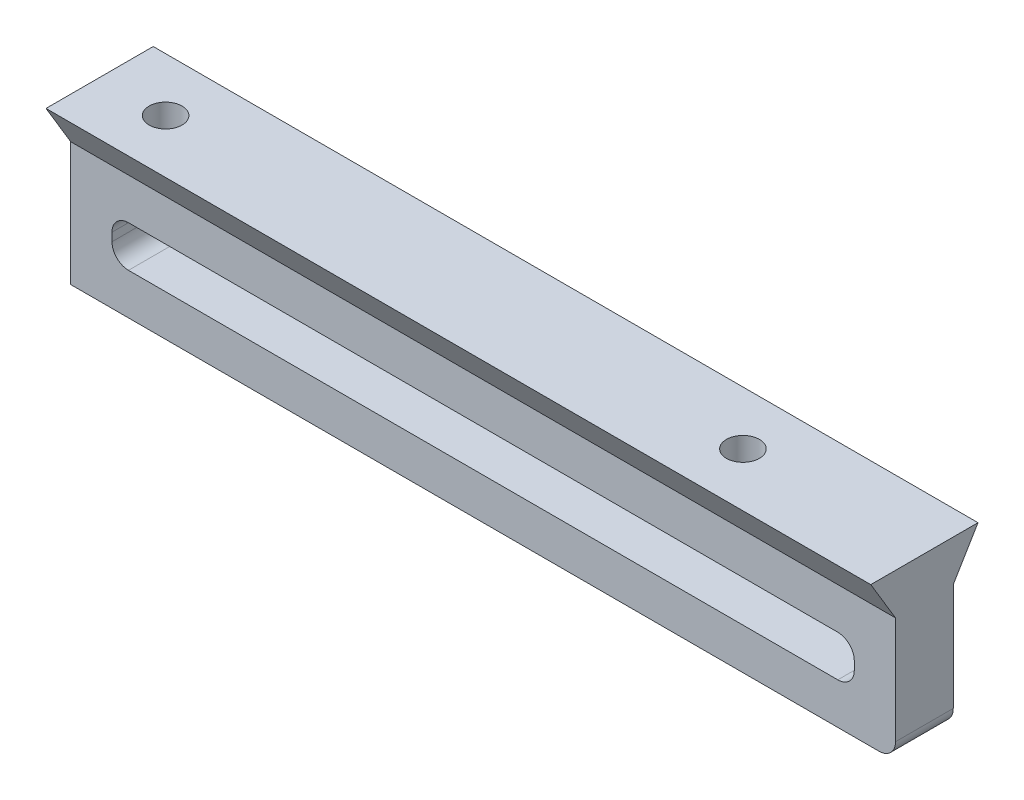
ISO-10303-21;
HEADER;
FILE_DESCRIPTION(('STEP AP214'),'2;1');
FILE_NAME('part.step','',(''),(''),'','','');
FILE_SCHEMA(('AUTOMOTIVE_DESIGN { 1 0 10303 214 1 1 1 1 }'));
ENDSEC;
DATA;
#1=APPLICATION_CONTEXT('core data for automotive mechanical design processes');
#2=APPLICATION_PROTOCOL_DEFINITION('international standard','automotive_design',2000,#1);
#3=PRODUCT_CONTEXT('',#1,'mechanical');
#4=PRODUCT('Part','Part','',(#3));
#5=PRODUCT_RELATED_PRODUCT_CATEGORY('part','',(#4));
#6=PRODUCT_DEFINITION_FORMATION('','',#4);
#7=PRODUCT_DEFINITION_CONTEXT('part definition',#1,'design');
#8=PRODUCT_DEFINITION('design','',#6,#7);
#9=PRODUCT_DEFINITION_SHAPE('','',#8);
#10=(LENGTH_UNIT() NAMED_UNIT(*) SI_UNIT(.MILLI.,.METRE.));
#11=(NAMED_UNIT(*) PLANE_ANGLE_UNIT() SI_UNIT($,.RADIAN.));
#12=(NAMED_UNIT(*) SI_UNIT($,.STERADIAN.) SOLID_ANGLE_UNIT());
#13=UNCERTAINTY_MEASURE_WITH_UNIT(LENGTH_MEASURE(1.E-05),#10,'distance_accuracy_value','');
#14=(GEOMETRIC_REPRESENTATION_CONTEXT(3) GLOBAL_UNCERTAINTY_ASSIGNED_CONTEXT((#13)) GLOBAL_UNIT_ASSIGNED_CONTEXT((#10,
#11,#12)) REPRESENTATION_CONTEXT('',''));
#15=CARTESIAN_POINT('',(0.,0.,0.));
#16=DIRECTION('',(0.,0.,1.));
#17=DIRECTION('',(1.,0.,0.));
#18=AXIS2_PLACEMENT_3D('',#15,#16,#17);
#19=CARTESIAN_POINT('',(-50.,20.,-3.5));
#20=DIRECTION('',(0.,0.,1.));
#21=DIRECTION('',(1.,0.,0.));
#22=AXIS2_PLACEMENT_3D('',#19,#20,#21);
#23=PLANE('',#22);
#24=DIRECTION('',(-1.,0.,0.));
#25=VECTOR('',#24,1.);
#26=CARTESIAN_POINT('',(45.,5.,-3.5));
#27=LINE('',#26,#25);
#28=CARTESIAN_POINT('',(43.,5.,-3.5));
#29=VERTEX_POINT('',#28);
#30=CARTESIAN_POINT('',(-43.,5.,-3.5));
#31=VERTEX_POINT('',#30);
#32=EDGE_CURVE('E391',#29,#31,#27,.T.);
#33=ORIENTED_EDGE('',*,*,#32,.F.);
#34=CARTESIAN_POINT('',(43.,7.,-3.5));
#35=DIRECTION('',(0.,0.,1.));
#36=DIRECTION('',(1.,0.,0.));
#37=AXIS2_PLACEMENT_3D('',#34,#35,#36);
#38=CIRCLE('',#37,2.);
#39=CARTESIAN_POINT('',(45.,7.,-3.5));
#40=VERTEX_POINT('',#39);
#41=EDGE_CURVE('E371',#29,#40,#38,.T.);
#42=ORIENTED_EDGE('',*,*,#41,.T.);
#43=DIRECTION('',(0.,-1.,0.));
#44=VECTOR('',#43,1.);
#45=CARTESIAN_POINT('',(45.,10.,-3.5));
#46=LINE('',#45,#44);
#47=CARTESIAN_POINT('',(45.,8.,-3.5));
#48=VERTEX_POINT('',#47);
#49=EDGE_CURVE('E394',#48,#40,#46,.T.);
#50=ORIENTED_EDGE('',*,*,#49,.F.);
#51=CARTESIAN_POINT('',(43.,8.,-3.5));
#52=DIRECTION('',(0.,0.,1.));
#53=DIRECTION('',(1.,0.,0.));
#54=AXIS2_PLACEMENT_3D('',#51,#52,#53);
#55=CIRCLE('',#54,2.);
#56=CARTESIAN_POINT('',(43.,10.,-3.5));
#57=VERTEX_POINT('',#56);
#58=EDGE_CURVE('E377',#48,#57,#55,.T.);
#59=ORIENTED_EDGE('',*,*,#58,.T.);
#60=DIRECTION('',(1.,0.,0.));
#61=VECTOR('',#60,1.);
#62=CARTESIAN_POINT('',(45.,10.,-3.5));
#63=LINE('',#62,#61);
#64=CARTESIAN_POINT('',(-43.,10.,-3.5));
#65=VERTEX_POINT('',#64);
#66=EDGE_CURVE('E402',#65,#57,#63,.T.);
#67=ORIENTED_EDGE('',*,*,#66,.F.);
#68=CARTESIAN_POINT('',(-43.,8.,-3.5));
#69=DIRECTION('',(0.,0.,1.));
#70=DIRECTION('',(1.,0.,0.));
#71=AXIS2_PLACEMENT_3D('',#68,#69,#70);
#72=CIRCLE('',#71,2.);
#73=CARTESIAN_POINT('',(-45.,8.,-3.5));
#74=VERTEX_POINT('',#73);
#75=EDGE_CURVE('E383',#65,#74,#72,.T.);
#76=ORIENTED_EDGE('',*,*,#75,.T.);
#77=DIRECTION('',(0.,1.,0.));
#78=VECTOR('',#77,1.);
#79=CARTESIAN_POINT('',(-45.,10.,-3.5));
#80=LINE('',#79,#78);
#81=CARTESIAN_POINT('',(-45.,7.,-3.5));
#82=VERTEX_POINT('',#81);
#83=EDGE_CURVE('E400',#82,#74,#80,.T.);
#84=ORIENTED_EDGE('',*,*,#83,.F.);
#85=CARTESIAN_POINT('',(-43.,7.,-3.5));
#86=DIRECTION('',(0.,0.,1.));
#87=DIRECTION('',(1.,0.,0.));
#88=AXIS2_PLACEMENT_3D('',#85,#86,#87);
#89=CIRCLE('',#88,2.);
#90=EDGE_CURVE('E376',#82,#31,#89,.T.);
#91=ORIENTED_EDGE('',*,*,#90,.T.);
#92=EDGE_LOOP('',(#33,#42,#50,#59,#67,#76,#84,#91));
#93=FACE_BOUND('',#92,.T.);
#94=DIRECTION('',(0.,-1.,0.));
#95=VECTOR('',#94,1.);
#96=CARTESIAN_POINT('',(50.,20.,-3.5));
#97=LINE('',#96,#95);
#98=CARTESIAN_POINT('',(50.,15.,-3.5));
#99=VERTEX_POINT('',#98);
#100=CARTESIAN_POINT('',(50.,2.,-3.5));
#101=VERTEX_POINT('',#100);
#102=EDGE_CURVE('E168',#99,#101,#97,.T.);
#103=ORIENTED_EDGE('',*,*,#102,.T.);
#104=CARTESIAN_POINT('',(48.,2.,-3.5));
#105=DIRECTION('',(0.,0.,1.));
#106=DIRECTION('',(1.,0.,0.));
#107=AXIS2_PLACEMENT_3D('',#104,#105,#106);
#108=CIRCLE('',#107,2.);
#109=CARTESIAN_POINT('',(48.,0.,-3.5));
#110=VERTEX_POINT('',#109);
#111=EDGE_CURVE('E65',#101,#110,#108,.F.);
#112=ORIENTED_EDGE('',*,*,#111,.T.);
#113=DIRECTION('',(-1.,0.,0.));
#114=VECTOR('',#113,1.);
#115=CARTESIAN_POINT('',(-50.,0.,-3.5));
#116=LINE('',#115,#114);
#117=CARTESIAN_POINT('',(-50.,0.,-3.5));
#118=VERTEX_POINT('',#117);
#119=EDGE_CURVE('E163',#110,#118,#116,.T.);
#120=ORIENTED_EDGE('',*,*,#119,.T.);
#121=DIRECTION('',(0.,-1.,0.));
#122=VECTOR('',#121,1.);
#123=CARTESIAN_POINT('',(-50.,20.,-3.5));
#124=LINE('',#123,#122);
#125=CARTESIAN_POINT('',(-50.,15.,-3.5));
#126=VERTEX_POINT('',#125);
#127=EDGE_CURVE('E160',#126,#118,#124,.T.);
#128=ORIENTED_EDGE('',*,*,#127,.F.);
#129=DIRECTION('',(-1.,0.,0.));
#130=VECTOR('',#129,1.);
#131=CARTESIAN_POINT('',(55.8309518948453,15.,-3.5));
#132=LINE('',#131,#130);
#133=EDGE_CURVE('E157',#99,#126,#132,.T.);
#134=ORIENTED_EDGE('',*,*,#133,.F.);
#135=EDGE_LOOP('',(#103,#112,#120,#128,#134));
#136=FACE_BOUND('',#135,.T.);
#137=ADVANCED_FACE('F41',(#93,#136),#23,.F.);
#138=CARTESIAN_POINT('',(50.,20.,-3.5));
#139=DIRECTION('',(-1.,0.,0.));
#140=DIRECTION('',(0.,0.,1.));
#141=AXIS2_PLACEMENT_3D('',#138,#139,#140);
#142=PLANE('',#141);
#143=DIRECTION('',(0.,-1.,0.));
#144=VECTOR('',#143,1.);
#145=CARTESIAN_POINT('',(50.,20.,3.5));
#146=LINE('',#145,#144);
#147=CARTESIAN_POINT('',(50.,15.,3.5));
#148=VERTEX_POINT('',#147);
#149=CARTESIAN_POINT('',(50.,2.,3.5));
#150=VERTEX_POINT('',#149);
#151=EDGE_CURVE('E212',#148,#150,#146,.T.);
#152=ORIENTED_EDGE('',*,*,#151,.T.);
#153=DIRECTION('',(0.,0.,-1.));
#154=VECTOR('',#153,1.);
#155=CARTESIAN_POINT('',(50.,2.,-3.5));
#156=LINE('',#155,#154);
#157=EDGE_CURVE('E297',#150,#101,#156,.T.);
#158=ORIENTED_EDGE('',*,*,#157,.T.);
#159=ORIENTED_EDGE('',*,*,#102,.F.);
#160=DIRECTION('',(0.,0.857492925712544,-0.514495755427526));
#161=VECTOR('',#160,1.);
#162=CARTESIAN_POINT('',(50.,20.,-6.5));
#163=LINE('',#162,#161);
#164=CARTESIAN_POINT('',(50.,20.,-6.5));
#165=VERTEX_POINT('',#164);
#166=EDGE_CURVE('E176',#99,#165,#163,.T.);
#167=ORIENTED_EDGE('',*,*,#166,.T.);
#168=DIRECTION('',(0.,0.,-1.));
#169=VECTOR('',#168,1.);
#170=CARTESIAN_POINT('',(50.,20.,-3.5));
#171=LINE('',#170,#169);
#172=CARTESIAN_POINT('',(50.,20.,6.5));
#173=VERTEX_POINT('',#172);
#174=EDGE_CURVE('E214',#173,#165,#171,.T.);
#175=ORIENTED_EDGE('',*,*,#174,.F.);
#176=DIRECTION('',(0.,-0.857492925712544,-0.514495755427526));
#177=VECTOR('',#176,1.);
#178=CARTESIAN_POINT('',(50.,20.,6.5));
#179=LINE('',#178,#177);
#180=EDGE_CURVE('E194',#173,#148,#179,.T.);
#181=ORIENTED_EDGE('',*,*,#180,.T.);
#182=EDGE_LOOP('',(#152,#158,#159,#167,#175,#181));
#183=FACE_BOUND('',#182,.T.);
#184=ADVANCED_FACE('F271',(#183),#142,.F.);
#185=CARTESIAN_POINT('',(-50.,20.,-3.5));
#186=DIRECTION('',(1.,0.,0.));
#187=DIRECTION('',(0.,0.,-1.));
#188=AXIS2_PLACEMENT_3D('',#185,#186,#187);
#189=PLANE('',#188);
#190=DIRECTION('',(0.,0.,1.));
#191=VECTOR('',#190,1.);
#192=CARTESIAN_POINT('',(-50.,0.,-3.5));
#193=LINE('',#192,#191);
#194=CARTESIAN_POINT('',(-50.,0.,3.5));
#195=VERTEX_POINT('',#194);
#196=EDGE_CURVE('E219',#118,#195,#193,.T.);
#197=ORIENTED_EDGE('',*,*,#196,.T.);
#198=DIRECTION('',(0.,-1.,0.));
#199=VECTOR('',#198,1.);
#200=CARTESIAN_POINT('',(-50.,20.,3.5));
#201=LINE('',#200,#199);
#202=CARTESIAN_POINT('',(-50.,15.,3.5));
#203=VERTEX_POINT('',#202);
#204=EDGE_CURVE('E170',#203,#195,#201,.T.);
#205=ORIENTED_EDGE('',*,*,#204,.F.);
#206=DIRECTION('',(0.,0.857492925712544,0.514495755427526));
#207=VECTOR('',#206,1.);
#208=CARTESIAN_POINT('',(-50.,20.,6.5));
#209=LINE('',#208,#207);
#210=CARTESIAN_POINT('',(-50.,20.,6.5));
#211=VERTEX_POINT('',#210);
#212=EDGE_CURVE('E182',#203,#211,#209,.T.);
#213=ORIENTED_EDGE('',*,*,#212,.T.);
#214=DIRECTION('',(0.,0.,1.));
#215=VECTOR('',#214,1.);
#216=CARTESIAN_POINT('',(-50.,20.,-3.5));
#217=LINE('',#216,#215);
#218=CARTESIAN_POINT('',(-50.,20.,-6.5));
#219=VERTEX_POINT('',#218);
#220=EDGE_CURVE('E181',#219,#211,#217,.T.);
#221=ORIENTED_EDGE('',*,*,#220,.F.);
#222=DIRECTION('',(0.,-0.857492925712544,0.514495755427526));
#223=VECTOR('',#222,1.);
#224=CARTESIAN_POINT('',(-50.,20.,-6.5));
#225=LINE('',#224,#223);
#226=EDGE_CURVE('E172',#219,#126,#225,.T.);
#227=ORIENTED_EDGE('',*,*,#226,.T.);
#228=ORIENTED_EDGE('',*,*,#127,.T.);
#229=EDGE_LOOP('',(#197,#205,#213,#221,#227,#228));
#230=FACE_BOUND('',#229,.T.);
#231=ADVANCED_FACE('F177',(#230),#189,.F.);
#232=CARTESIAN_POINT('',(-50.,20.,3.5));
#233=DIRECTION('',(0.,0.,-1.));
#234=DIRECTION('',(-1.,0.,0.));
#235=AXIS2_PLACEMENT_3D('',#232,#233,#234);
#236=PLANE('',#235);
#237=DIRECTION('',(0.,1.,0.));
#238=VECTOR('',#237,1.);
#239=CARTESIAN_POINT('',(-45.,20.,3.5));
#240=LINE('',#239,#238);
#241=CARTESIAN_POINT('',(-45.,7.,3.5));
#242=VERTEX_POINT('',#241);
#243=CARTESIAN_POINT('',(-45.,8.,3.5));
#244=VERTEX_POINT('',#243);
#245=EDGE_CURVE('E227',#242,#244,#240,.T.);
#246=ORIENTED_EDGE('',*,*,#245,.T.);
#247=CARTESIAN_POINT('',(-43.,8.,3.5));
#248=DIRECTION('',(0.,0.,-1.));
#249=DIRECTION('',(-1.,0.,0.));
#250=AXIS2_PLACEMENT_3D('',#247,#248,#249);
#251=CIRCLE('',#250,2.);
#252=CARTESIAN_POINT('',(-43.,10.,3.5));
#253=VERTEX_POINT('',#252);
#254=EDGE_CURVE('E386',#244,#253,#251,.T.);
#255=ORIENTED_EDGE('',*,*,#254,.T.);
#256=DIRECTION('',(1.,0.,0.));
#257=VECTOR('',#256,1.);
#258=CARTESIAN_POINT('',(-50.,10.,3.5));
#259=LINE('',#258,#257);
#260=CARTESIAN_POINT('',(43.,10.,3.5));
#261=VERTEX_POINT('',#260);
#262=EDGE_CURVE('E229',#253,#261,#259,.T.);
#263=ORIENTED_EDGE('',*,*,#262,.T.);
#264=CARTESIAN_POINT('',(43.,8.,3.5));
#265=DIRECTION('',(0.,0.,-1.));
#266=DIRECTION('',(-1.,0.,0.));
#267=AXIS2_PLACEMENT_3D('',#264,#265,#266);
#268=CIRCLE('',#267,2.);
#269=CARTESIAN_POINT('',(45.,8.,3.5));
#270=VERTEX_POINT('',#269);
#271=EDGE_CURVE('E372',#261,#270,#268,.T.);
#272=ORIENTED_EDGE('',*,*,#271,.T.);
#273=DIRECTION('',(0.,-1.,0.));
#274=VECTOR('',#273,1.);
#275=CARTESIAN_POINT('',(45.,20.,3.5));
#276=LINE('',#275,#274);
#277=CARTESIAN_POINT('',(45.,7.,3.5));
#278=VERTEX_POINT('',#277);
#279=EDGE_CURVE('E231',#270,#278,#276,.T.);
#280=ORIENTED_EDGE('',*,*,#279,.T.);
#281=CARTESIAN_POINT('',(43.,7.,3.5));
#282=DIRECTION('',(0.,0.,-1.));
#283=DIRECTION('',(-1.,0.,0.));
#284=AXIS2_PLACEMENT_3D('',#281,#282,#283);
#285=CIRCLE('',#284,2.);
#286=CARTESIAN_POINT('',(43.,5.,3.5));
#287=VERTEX_POINT('',#286);
#288=EDGE_CURVE('E369',#278,#287,#285,.T.);
#289=ORIENTED_EDGE('',*,*,#288,.T.);
#290=DIRECTION('',(-1.,0.,0.));
#291=VECTOR('',#290,1.);
#292=CARTESIAN_POINT('',(-50.,5.,3.5));
#293=LINE('',#292,#291);
#294=CARTESIAN_POINT('',(-43.,5.,3.5));
#295=VERTEX_POINT('',#294);
#296=EDGE_CURVE('E222',#287,#295,#293,.T.);
#297=ORIENTED_EDGE('',*,*,#296,.T.);
#298=CARTESIAN_POINT('',(-43.,7.,3.5));
#299=DIRECTION('',(0.,0.,-1.));
#300=DIRECTION('',(-1.,0.,0.));
#301=AXIS2_PLACEMENT_3D('',#298,#299,#300);
#302=CIRCLE('',#301,2.);
#303=EDGE_CURVE('E384',#295,#242,#302,.T.);
#304=ORIENTED_EDGE('',*,*,#303,.T.);
#305=EDGE_LOOP('',(#246,#255,#263,#272,#280,#289,#297,#304));
#306=FACE_BOUND('',#305,.T.);
#307=DIRECTION('',(1.,0.,0.));
#308=VECTOR('',#307,1.);
#309=CARTESIAN_POINT('',(-50.,0.,3.5));
#310=LINE('',#309,#308);
#311=CARTESIAN_POINT('',(48.,0.,3.5));
#312=VERTEX_POINT('',#311);
#313=EDGE_CURVE('E215',#195,#312,#310,.T.);
#314=ORIENTED_EDGE('',*,*,#313,.T.);
#315=CARTESIAN_POINT('',(48.,2.,3.5));
#316=DIRECTION('',(0.,0.,-1.));
#317=DIRECTION('',(-1.,0.,0.));
#318=AXIS2_PLACEMENT_3D('',#315,#316,#317);
#319=CIRCLE('',#318,2.);
#320=EDGE_CURVE('E11',#312,#150,#319,.F.);
#321=ORIENTED_EDGE('',*,*,#320,.T.);
#322=ORIENTED_EDGE('',*,*,#151,.F.);
#323=DIRECTION('',(-1.,0.,0.));
#324=VECTOR('',#323,1.);
#325=CARTESIAN_POINT('',(55.8309518948453,15.,3.5));
#326=LINE('',#325,#324);
#327=EDGE_CURVE('E184',#148,#203,#326,.T.);
#328=ORIENTED_EDGE('',*,*,#327,.T.);
#329=ORIENTED_EDGE('',*,*,#204,.T.);
#330=EDGE_LOOP('',(#314,#321,#322,#328,#329));
#331=FACE_BOUND('',#330,.T.);
#332=ADVANCED_FACE('F323',(#306,#331),#236,.F.);
#333=CARTESIAN_POINT('',(0.,20.,0.));
#334=DIRECTION('',(0.,1.,0.));
#335=DIRECTION('',(0.,0.,1.));
#336=AXIS2_PLACEMENT_3D('',#333,#334,#335);
#337=PLANE('',#336);
#338=CARTESIAN_POINT('',(-42.,20.,0.));
#339=DIRECTION('',(0.,1.,0.));
#340=DIRECTION('',(0.,0.,1.));
#341=AXIS2_PLACEMENT_3D('',#338,#339,#340);
#342=CIRCLE('',#341,2.);
#343=CARTESIAN_POINT('',(-42.,20.,2.));
#344=VERTEX_POINT('',#343);
#345=EDGE_CURVE('E201',#344,#344,#342,.T.);
#346=ORIENTED_EDGE('',*,*,#345,.F.);
#347=EDGE_LOOP('',(#346));
#348=FACE_BOUND('',#347,.T.);
#349=CARTESIAN_POINT('',(28.,20.,0.));
#350=DIRECTION('',(0.,1.,0.));
#351=DIRECTION('',(0.,0.,1.));
#352=AXIS2_PLACEMENT_3D('',#349,#350,#351);
#353=CIRCLE('',#352,2.);
#354=CARTESIAN_POINT('',(28.,20.,2.));
#355=VERTEX_POINT('',#354);
#356=EDGE_CURVE('E207',#355,#355,#353,.T.);
#357=ORIENTED_EDGE('',*,*,#356,.F.);
#358=EDGE_LOOP('',(#357));
#359=FACE_BOUND('',#358,.T.);
#360=ORIENTED_EDGE('',*,*,#174,.T.);
#361=DIRECTION('',(-1.,0.,0.));
#362=VECTOR('',#361,1.);
#363=CARTESIAN_POINT('',(55.8309518948453,20.,-6.5));
#364=LINE('',#363,#362);
#365=EDGE_CURVE('E180',#165,#219,#364,.T.);
#366=ORIENTED_EDGE('',*,*,#365,.T.);
#367=ORIENTED_EDGE('',*,*,#220,.T.);
#368=DIRECTION('',(-1.,0.,0.));
#369=VECTOR('',#368,1.);
#370=CARTESIAN_POINT('',(55.8309518948453,20.,6.5));
#371=LINE('',#370,#369);
#372=EDGE_CURVE('E195',#173,#211,#371,.T.);
#373=ORIENTED_EDGE('',*,*,#372,.F.);
#374=EDGE_LOOP('',(#360,#366,#367,#373));
#375=FACE_BOUND('',#374,.T.);
#376=ADVANCED_FACE('F329',(#348,#359,#375),#337,.T.);
#377=CARTESIAN_POINT('',(0.,0.,0.));
#378=DIRECTION('',(0.,1.,0.));
#379=DIRECTION('',(0.,0.,1.));
#380=AXIS2_PLACEMENT_3D('',#377,#378,#379);
#381=PLANE('',#380);
#382=ORIENTED_EDGE('',*,*,#119,.F.);
#383=DIRECTION('',(0.,0.,-1.));
#384=VECTOR('',#383,1.);
#385=CARTESIAN_POINT('',(48.,0.,0.));
#386=LINE('',#385,#384);
#387=EDGE_CURVE('E47',#110,#312,#386,.F.);
#388=ORIENTED_EDGE('',*,*,#387,.T.);
#389=ORIENTED_EDGE('',*,*,#313,.F.);
#390=ORIENTED_EDGE('',*,*,#196,.F.);
#391=EDGE_LOOP('',(#382,#388,#389,#390));
#392=FACE_BOUND('',#391,.T.);
#393=ADVANCED_FACE('F330',(#392),#381,.F.);
#394=CARTESIAN_POINT('',(28.,10.,0.));
#395=DIRECTION('',(0.,1.,0.));
#396=DIRECTION('',(0.,0.,1.));
#397=AXIS2_PLACEMENT_3D('',#394,#395,#396);
#398=CYLINDRICAL_SURFACE('',#397,2.);
#399=CARTESIAN_POINT('',(28.,10.,0.));
#400=DIRECTION('',(0.,1.,0.));
#401=DIRECTION('',(0.,0.,1.));
#402=AXIS2_PLACEMENT_3D('',#399,#400,#401);
#403=CIRCLE('',#402,2.);
#404=CARTESIAN_POINT('',(28.,10.,2.));
#405=VERTEX_POINT('',#404);
#406=EDGE_CURVE('E193',#405,#405,#403,.T.);
#407=ORIENTED_EDGE('',*,*,#406,.F.);
#408=EDGE_LOOP('',(#407));
#409=FACE_BOUND('',#408,.T.);
#410=ORIENTED_EDGE('',*,*,#356,.T.);
#411=EDGE_LOOP('',(#410));
#412=FACE_BOUND('',#411,.T.);
#413=ADVANCED_FACE('F335',(#409,#412),#398,.F.);
#414=CARTESIAN_POINT('',(-42.,10.,0.));
#415=DIRECTION('',(0.,1.,0.));
#416=DIRECTION('',(0.,0.,1.));
#417=AXIS2_PLACEMENT_3D('',#414,#415,#416);
#418=CYLINDRICAL_SURFACE('',#417,2.);
#419=CARTESIAN_POINT('',(-42.,10.,0.));
#420=DIRECTION('',(0.,1.,0.));
#421=DIRECTION('',(0.,0.,1.));
#422=AXIS2_PLACEMENT_3D('',#419,#420,#421);
#423=CIRCLE('',#422,2.);
#424=CARTESIAN_POINT('',(-43.,10.,-1.73205080756888));
#425=VERTEX_POINT('',#424);
#426=CARTESIAN_POINT('',(-43.,10.,1.73205080756888));
#427=VERTEX_POINT('',#426);
#428=EDGE_CURVE('E200',#425,#427,#423,.T.);
#429=ORIENTED_EDGE('',*,*,#428,.F.);
#430=EDGE_CURVE('E205',#427,#425,#423,.T.);
#431=ORIENTED_EDGE('',*,*,#430,.F.);
#432=EDGE_LOOP('',(#429,#431));
#433=FACE_BOUND('',#432,.T.);
#434=ORIENTED_EDGE('',*,*,#345,.T.);
#435=EDGE_LOOP('',(#434));
#436=FACE_BOUND('',#435,.T.);
#437=ADVANCED_FACE('F340',(#433,#436),#418,.F.);
#438=CARTESIAN_POINT('',(55.8309518948453,20.,6.5));
#439=DIRECTION('',(0.,-0.514495755427526,0.857492925712544));
#440=DIRECTION('',(0.,-0.857492925712544,-0.514495755427526));
#441=AXIS2_PLACEMENT_3D('',#438,#439,#440);
#442=PLANE('',#441);
#443=ORIENTED_EDGE('',*,*,#180,.F.);
#444=ORIENTED_EDGE('',*,*,#372,.T.);
#445=ORIENTED_EDGE('',*,*,#212,.F.);
#446=ORIENTED_EDGE('',*,*,#327,.F.);
#447=EDGE_LOOP('',(#443,#444,#445,#446));
#448=FACE_BOUND('',#447,.T.);
#449=ADVANCED_FACE('F341',(#448),#442,.T.);
#450=CARTESIAN_POINT('',(55.8309518948453,20.,-6.5));
#451=DIRECTION('',(0.,-0.514495755427526,-0.857492925712544));
#452=DIRECTION('',(0.,0.857492925712544,-0.514495755427526));
#453=AXIS2_PLACEMENT_3D('',#450,#451,#452);
#454=PLANE('',#453);
#455=ORIENTED_EDGE('',*,*,#166,.F.);
#456=ORIENTED_EDGE('',*,*,#133,.T.);
#457=ORIENTED_EDGE('',*,*,#226,.F.);
#458=ORIENTED_EDGE('',*,*,#365,.F.);
#459=EDGE_LOOP('',(#455,#456,#457,#458));
#460=FACE_BOUND('',#459,.T.);
#461=ADVANCED_FACE('F175',(#460),#454,.T.);
#462=CARTESIAN_POINT('',(45.,10.,6.5));
#463=DIRECTION('',(1.,0.,0.));
#464=DIRECTION('',(0.,0.,-1.));
#465=AXIS2_PLACEMENT_3D('',#462,#463,#464);
#466=PLANE('',#465);
#467=ORIENTED_EDGE('',*,*,#279,.F.);
#468=DIRECTION('',(0.,0.,-1.));
#469=VECTOR('',#468,1.);
#470=CARTESIAN_POINT('',(45.,8.,-3.5));
#471=LINE('',#470,#469);
#472=EDGE_CURVE('E238',#270,#48,#471,.T.);
#473=ORIENTED_EDGE('',*,*,#472,.T.);
#474=ORIENTED_EDGE('',*,*,#49,.T.);
#475=DIRECTION('',(0.,0.,-1.));
#476=VECTOR('',#475,1.);
#477=CARTESIAN_POINT('',(45.,7.,3.5));
#478=LINE('',#477,#476);
#479=EDGE_CURVE('E236',#40,#278,#478,.F.);
#480=ORIENTED_EDGE('',*,*,#479,.T.);
#481=EDGE_LOOP('',(#467,#473,#474,#480));
#482=FACE_BOUND('',#481,.T.);
#483=ADVANCED_FACE('F350',(#482),#466,.F.);
#484=CARTESIAN_POINT('',(45.,10.,6.5));
#485=DIRECTION('',(0.,1.,0.));
#486=DIRECTION('',(0.,0.,1.));
#487=AXIS2_PLACEMENT_3D('',#484,#485,#486);
#488=PLANE('',#487);
#489=ORIENTED_EDGE('',*,*,#406,.T.);
#490=EDGE_LOOP('',(#489));
#491=FACE_BOUND('',#490,.T.);
#492=ORIENTED_EDGE('',*,*,#66,.T.);
#493=DIRECTION('',(0.,0.,-1.));
#494=VECTOR('',#493,1.);
#495=CARTESIAN_POINT('',(43.,10.,3.5));
#496=LINE('',#495,#494);
#497=EDGE_CURVE('E246',#57,#261,#496,.F.);
#498=ORIENTED_EDGE('',*,*,#497,.T.);
#499=ORIENTED_EDGE('',*,*,#262,.F.);
#500=DIRECTION('',(0.,0.,-1.));
#501=VECTOR('',#500,1.);
#502=CARTESIAN_POINT('',(-43.,10.,-3.5));
#503=LINE('',#502,#501);
#504=EDGE_CURVE('E243',#253,#427,#503,.T.);
#505=ORIENTED_EDGE('',*,*,#504,.T.);
#506=ORIENTED_EDGE('',*,*,#430,.T.);
#507=DIRECTION('',(0.,0.,-1.));
#508=VECTOR('',#507,1.);
#509=CARTESIAN_POINT('',(-43.,10.,-3.5));
#510=LINE('',#509,#508);
#511=EDGE_CURVE('E241',#425,#65,#510,.T.);
#512=ORIENTED_EDGE('',*,*,#511,.T.);
#513=EDGE_LOOP('',(#492,#498,#499,#505,#506,#512));
#514=FACE_BOUND('',#513,.T.);
#515=ADVANCED_FACE('F353',(#491,#514),#488,.F.);
#516=CARTESIAN_POINT('',(-45.,10.,6.5));
#517=DIRECTION('',(-1.,0.,0.));
#518=DIRECTION('',(0.,0.,1.));
#519=AXIS2_PLACEMENT_3D('',#516,#517,#518);
#520=PLANE('',#519);
#521=ORIENTED_EDGE('',*,*,#245,.F.);
#522=DIRECTION('',(0.,0.,-1.));
#523=VECTOR('',#522,1.);
#524=CARTESIAN_POINT('',(-45.,7.,-3.5));
#525=LINE('',#524,#523);
#526=EDGE_CURVE('E416',#242,#82,#525,.T.);
#527=ORIENTED_EDGE('',*,*,#526,.T.);
#528=ORIENTED_EDGE('',*,*,#83,.T.);
#529=DIRECTION('',(0.,0.,-1.));
#530=VECTOR('',#529,1.);
#531=CARTESIAN_POINT('',(-45.,8.,3.5));
#532=LINE('',#531,#530);
#533=CARTESIAN_POINT('',(-45.,8.,-1.73205080756888));
#534=VERTEX_POINT('',#533);
#535=EDGE_CURVE('E262',#74,#534,#532,.F.);
#536=ORIENTED_EDGE('',*,*,#535,.T.);
#537=CARTESIAN_POINT('',(-42.7870328877414,10.,1.83863515511194));
#538=CARTESIAN_POINT('',(-45.,10.2294552179399,1.77934327190484));
#539=CARTESIAN_POINT('',(-45.,8.07461341625113,2.336160543626));
#540=CARTESIAN_POINT('',(-42.8035832417197,10.,1.83152959676092));
#541=CARTESIAN_POINT('',(-45.,10.2113936820577,1.78345801909766));
#542=CARTESIAN_POINT('',(-45.,8.05958578145523,2.27804801303387));
#543=CARTESIAN_POINT('',(-42.8212400802493,10.,1.8237265076236));
#544=CARTESIAN_POINT('',(-45.,10.1917046398193,1.7855080996234));
#545=CARTESIAN_POINT('',(-45.,8.04691346683023,2.21934666709868));
#546=CARTESIAN_POINT('',(-42.8591795123815,10.,1.80617572011669));
#547=CARTESIAN_POINT('',(-45.,10.1495042951372,1.78445632375741));
#548=CARTESIAN_POINT('',(-45.,8.0260887534647,2.10088644161999));
#549=CARTESIAN_POINT('',(-42.8794729934177,10.,1.79641986251542));
#550=CARTESIAN_POINT('',(-45.,10.1270342510522,1.78138604296667));
#551=CARTESIAN_POINT('',(-45.,8.01795588094638,2.04112411728933));
#552=CARTESIAN_POINT('',(-42.9227870798924,10.,1.77455461615092));
#553=CARTESIAN_POINT('',(-45.,10.0800013036567,1.76928153127162));
#554=CARTESIAN_POINT('',(-45.,8.00619296212229,1.92164959355257));
#555=CARTESIAN_POINT('',(-42.945784304838,10.,1.76246489764468));
#556=CARTESIAN_POINT('',(-45.,10.0555147010345,1.76037072153556));
#557=CARTESIAN_POINT('',(-45.,8.0025270347022,1.86194089693239));
#558=CARTESIAN_POINT('',(-42.9826476192547,10.,1.74201057701243));
#559=CARTESIAN_POINT('',(-45.,10.0174692650382,1.74190985791899));
#560=CARTESIAN_POINT('',(-45.,8.00013635194222,1.7724009130998));
#561=CARTESIAN_POINT('',(-42.9953093651777,10.,1.73481827222743));
#562=CARTESIAN_POINT('',(-45.,10.0046580087429,1.73496863935216));
#563=CARTESIAN_POINT('',(-45.,7.99985561010299,1.7426024472028));
#564=CARTESIAN_POINT('',(-43.0214728394438,10.,1.71953977784523));
#565=CARTESIAN_POINT('',(-45.,9.97871497185958,1.71932027785796));
#566=CARTESIAN_POINT('',(-45.,8.00028287957462,1.68301093054066));
#567=CARTESIAN_POINT('',(-43.0349746430132,10.,1.71145350814382));
#568=CARTESIAN_POINT('',(-45.,9.965589784063,1.71062714829255));
#569=CARTESIAN_POINT('',(-45.,8.00099097955741,1.65321788050077));
#570=CARTESIAN_POINT('',(-43.0974523137048,10.,1.67299864468955));
#571=CARTESIAN_POINT('',(-45.,9.90674600946465,1.66788537669126));
#572=CARTESIAN_POINT('',(-45.,8.00630155167717,1.51985676704885));
#573=CARTESIAN_POINT('',(-43.1514077291953,10.,1.63707800644509));
#574=CARTESIAN_POINT('',(-45.,9.85932205062629,1.62358112092185));
#575=CARTESIAN_POINT('',(-45.,8.01620641631756,1.41645925819389));
#576=CARTESIAN_POINT('',(-43.2413272612541,10.,1.56859270998429));
#577=CARTESIAN_POINT('',(-45.,9.78848682030377,1.5361260307508));
#578=CARTESIAN_POINT('',(-45.,8.03791332812455,1.26240120924946));
#579=CARTESIAN_POINT('',(-43.2728176149391,10.,1.54331261368433));
#580=CARTESIAN_POINT('',(-45.,9.76518472099896,1.50392757506437));
#581=CARTESIAN_POINT('',(-45.,8.04629695011717,1.21119418386955));
#582=CARTESIAN_POINT('',(-43.3387394917631,10.,1.48650082561343));
#583=CARTESIAN_POINT('',(-45.,9.7194356137354,1.43230790726633));
#584=CARTESIAN_POINT('',(-45.,8.06492362856384,1.10911765726282));
#585=CARTESIAN_POINT('',(-43.3731708680097,10.,1.45496944596555));
#586=CARTESIAN_POINT('',(-45.,9.69699839013173,1.39302305852457));
#587=CARTESIAN_POINT('',(-45.,8.07516659217987,1.05824813931546));
#588=CARTESIAN_POINT('',(-43.4445676144875,10.,1.38410608180833));
#589=CARTESIAN_POINT('',(-45.,9.65360317701435,1.30684122594179));
#590=CARTESIAN_POINT('',(-45.,8.09698258408099,0.956896658269227));
#591=CARTESIAN_POINT('',(-43.4815284237568,10.,1.34478790758062));
#592=CARTESIAN_POINT('',(-45.,9.63263814296407,1.26010226818523));
#593=CARTESIAN_POINT('',(-45.,8.1085532425649,0.906414171081091));
#594=CARTESIAN_POINT('',(-43.5571898463925,10.,1.2564024496941));
#595=CARTESIAN_POINT('',(-45.,9.59274320154123,1.15855275176113));
#596=CARTESIAN_POINT('',(-45.,8.13239628134066,0.805617103997504));
#597=CARTESIAN_POINT('',(-43.5958904923836,10.,1.20733498316035));
#598=CARTESIAN_POINT('',(-45.,9.57379006150244,1.10387884193465));
#599=CARTESIAN_POINT('',(-45.,8.1446686747924,0.75530252726968));
#600=CARTESIAN_POINT('',(-43.6733818832946,10.,1.09741188651685));
#601=CARTESIAN_POINT('',(-45.,9.53852362180077,0.986191767240073));
#602=CARTESIAN_POINT('',(-45.,8.16910331046182,0.654642319911311));
#603=CARTESIAN_POINT('',(-43.7121726344433,10.,1.03655541595094));
#604=CARTESIAN_POINT('',(-45.,9.52216704160612,0.923281535799466));
#605=CARTESIAN_POINT('',(-45.,8.18126554476134,0.604296687321982));
#606=CARTESIAN_POINT('',(-43.7870445738888,10.,0.901350392884264));
#607=CARTESIAN_POINT('',(-45.,9.4926966214365,0.789182193390542));
#608=CARTESIAN_POINT('',(-45.,8.20446034488871,0.503325786288473));
#609=CARTESIAN_POINT('',(-43.8231251647649,10.,0.826998877839221));
#610=CARTESIAN_POINT('',(-45.,9.47952128572177,0.718017824244611));
#611=CARTESIAN_POINT('',(-45.,8.2154926618342,0.452700458814072));
#612=CARTESIAN_POINT('',(-43.8895045196325,10.,0.661754477999852));
#613=CARTESIAN_POINT('',(-45.,9.45663758650443,0.565731960423694));
#614=CARTESIAN_POINT('',(-45.,8.23552690178571,0.349293200051616));
#615=CARTESIAN_POINT('',(-43.919573217489,10.,0.570396733739987));
#616=CARTESIAN_POINT('',(-45.,9.44697511834834,0.484212407210446));
#617=CARTESIAN_POINT('',(-45.,8.2444498163561,0.29649522805882));
#618=CARTESIAN_POINT('',(-43.9669180010623,10.,0.375746026021592));
#619=CARTESIAN_POINT('',(-45.,9.43231588980254,0.315428080792549));
#620=CARTESIAN_POINT('',(-45.,8.25837476811757,0.190392666129199));
#621=CARTESIAN_POINT('',(-43.9842034588231,10.,0.272461870781565));
#622=CARTESIAN_POINT('',(-45.,9.42724632660584,0.227843075065658));
#623=CARTESIAN_POINT('',(-45.,8.26337967795528,0.1370884764249));
#624=CARTESIAN_POINT('',(-44.001846833861,10.,0.0613096051291972));
#625=CARTESIAN_POINT('',(-45.,9.42210487092666,0.0510135222531485));
#626=CARTESIAN_POINT('',(-45.,8.26848709415933,0.0303813299680532));
#627=CARTESIAN_POINT('',(-44.0022527506897,10.,-0.0465446339052145));
#628=CARTESIAN_POINT('',(-45.,9.42198978413152,-0.038715164405895));
#629=CARTESIAN_POINT('',(-45.,8.26860350173751,-0.023020914810025));
#630=CARTESIAN_POINT('',(-43.9861484310859,10.,-0.25784992765415));
#631=CARTESIAN_POINT('',(-45.,9.42667616399865,-0.21552825786838));
#632=CARTESIAN_POINT('',(-45.,8.26394335239336,-0.129618981179293));
#633=CARTESIAN_POINT('',(-43.9696310453082,10.,-0.361299102186692));
#634=CARTESIAN_POINT('',(-45.,9.43150629751127,-0.303106020064011));
#635=CARTESIAN_POINT('',(-45.,8.25916472753698,-0.182814705991367));
#636=CARTESIAN_POINT('',(-43.9236120851223,10.,-0.556665046016534));
#637=CARTESIAN_POINT('',(-45.,9.44569597651504,-0.472110305713207));
#638=CARTESIAN_POINT('',(-45.,8.24564416548344,-0.288753147991196));
#639=CARTESIAN_POINT('',(-43.8940902720141,10.,-0.64856355140796));
#640=CARTESIAN_POINT('',(-45.,9.45513042332169,-0.553859835049194));
#641=CARTESIAN_POINT('',(-45.,8.23689604995453,-0.341495027902021));
#642=CARTESIAN_POINT('',(-43.8274850050162,10.,-0.817682499071886));
#643=CARTESIAN_POINT('',(-45.,9.47795492300223,-0.709202885278414));
#644=CARTESIAN_POINT('',(-45.,8.21682124017644,-0.446475624139437));
#645=CARTESIAN_POINT('',(-43.79039963709,10.,-0.894899216388188));
#646=CARTESIAN_POINT('',(-45.,9.49142551018392,-0.782921956285021));
#647=CARTESIAN_POINT('',(-45.,8.20549389314112,-0.498714209590907));
#648=CARTESIAN_POINT('',(-43.7131344516406,10.,-1.03519121493863));
#649=CARTESIAN_POINT('',(-45.,9.52175360147232,-0.921858494037445));
#650=CARTESIAN_POINT('',(-45.,8.18156906294368,-0.603082058940563));
#651=CARTESIAN_POINT('',(-43.6729442461086,10.,-1.09821599448085));
#652=CARTESIAN_POINT('',(-45.,9.53869123428232,-0.987014196572716));
#653=CARTESIAN_POINT('',(-45.,8.16896726813713,-0.65521029832405));
#654=CARTESIAN_POINT('',(-43.5927125504135,10.,-1.21165103306776));
#655=CARTESIAN_POINT('',(-45.,9.57528928461225,-1.1086021465099));
#656=CARTESIAN_POINT('',(-45.,8.14366451559042,-0.759431332751754));
#657=CARTESIAN_POINT('',(-43.5526710316462,10.,-1.26206385704236));
#658=CARTESIAN_POINT('',(-45.,9.59499698312281,-1.16492024982028));
#659=CARTESIAN_POINT('',(-45.,8.1309635785558,-0.811524132850695));
#660=CARTESIAN_POINT('',(-43.4875155035835,10.,-1.33748879447533));
#661=CARTESIAN_POINT('',(-45.,9.6295153684477,-1.251642144543));
#662=CARTESIAN_POINT('',(-45.,8.11044673775649,-0.898529892741422));
#663=CARTESIAN_POINT('',(-43.4618686033088,10.,-1.36537064392018));
#664=CARTESIAN_POINT('',(-45.,9.64384169414912,-1.284525750896));
#665=CARTESIAN_POINT('',(-45.,8.10241184417567,-0.933390494572951));
#666=CARTESIAN_POINT('',(-43.4117356362383,10.,-1.41714596365051));
#667=CARTESIAN_POINT('',(-45.,9.67323757485441,-1.34667882749485));
#668=CARTESIAN_POINT('',(-45.,8.08691271094886,-1.00321341808203));
#669=CARTESIAN_POINT('',(-43.3872487593731,10.,-1.44104224743756));
#670=CARTESIAN_POINT('',(-45.,9.68830992958334,-1.37590407579587));
#671=CARTESIAN_POINT('',(-45.,8.07944807078271,-1.03817565012576));
#672=CARTESIAN_POINT('',(-43.339666321961,10.,-1.48537777648422));
#673=CARTESIAN_POINT('',(-45.,9.71897404153363,-1.43082737346432));
#674=CARTESIAN_POINT('',(-45.,8.06529022468184,-1.10814716107735));
#675=CARTESIAN_POINT('',(-43.3165667761475,10.,-1.50582726223134));
#676=CARTESIAN_POINT('',(-45.,9.73456403942189,-1.456490687784));
#677=CARTESIAN_POINT('',(-45.,8.05859475311127,-1.14315597761633));
#678=CARTESIAN_POINT('',(-43.2717554065143,10.,-1.54385932472394));
#679=CARTESIAN_POINT('',(-45.,9.76612830247709,-1.50454865766611));
#680=CARTESIAN_POINT('',(-45.,8.04610486648945,-1.21334091242933));
#681=CARTESIAN_POINT('',(-43.2500438080908,10.,-1.56144143653701));
#682=CARTESIAN_POINT('',(-45.,9.78209898389238,-1.52689921655782));
#683=CARTESIAN_POINT('',(-45.,8.04031059757138,-1.24851705688509));
#684=CARTESIAN_POINT('',(-43.2080875105749,10.,-1.59412355639208));
#685=CARTESIAN_POINT('',(-45.,9.81420183423145,-1.56842470076579));
#686=CARTESIAN_POINT('',(-45.,8.0297737793522,-1.3189332390009));
#687=CARTESIAN_POINT('',(-43.1878390853853,10.,-1.6092300031363));
#688=CARTESIAN_POINT('',(-45.,9.83032773695935,-1.58756847376894));
#689=CARTESIAN_POINT('',(-45.,8.02502849026717,-1.35417286193189));
#690=CARTESIAN_POINT('',(-43.1487258144432,10.,-1.63737814523142));
#691=CARTESIAN_POINT('',(-45.,9.86261154097668,-1.62290427819749));
#692=CARTESIAN_POINT('',(-45.,8.01668556283593,-1.42478538451671));
#693=CARTESIAN_POINT('',(-43.1298609219984,10.,-1.65041991027972));
#694=CARTESIAN_POINT('',(-45.,9.87876134256622,-1.63906036630374));
#695=CARTESIAN_POINT('',(-45.,8.01308788574565,-1.46015827963037));
#696=CARTESIAN_POINT('',(-43.0752189696641,10.,-1.68696228390911));
#697=CARTESIAN_POINT('',(-45.,9.92726787434899,-1.68357946747943));
#698=CARTESIAN_POINT('',(-45.,8.00416177765943,-1.56654157108277));
#699=CARTESIAN_POINT('',(-43.0414494412483,10.,-1.70783884362077));
#700=CARTESIAN_POINT('',(-45.,9.95916155294192,-1.70736322937584));
#701=CARTESIAN_POINT('',(-45.,8.0007146471409,-1.6377241195125));
#702=CARTESIAN_POINT('',(-42.9789701591545,10.,-1.74439302435753));
#703=CARTESIAN_POINT('',(-45.,10.0210041396009,-1.7449837721346));
#704=CARTESIAN_POINT('',(-45.,7.99948962410035,-1.77961732044016));
#705=CARTESIAN_POINT('',(-42.9502246495494,10.,-1.76010814894321));
#706=CARTESIAN_POINT('',(-45.,10.0508796495403,-1.75870456734026));
#707=CARTESIAN_POINT('',(-45.,8.00166976733601,-1.85032754614925));
#708=CARTESIAN_POINT('',(-42.8969157313505,10.,-1.78785921574556));
#709=CARTESIAN_POINT('',(-45.,10.1079035250164,-1.77772846278703));
#710=CARTESIAN_POINT('',(-45.,8.01205045661447,-1.99125092753604));
#711=CARTESIAN_POINT('',(-42.8723485178002,10.,-1.79989851337894));
#712=CARTESIAN_POINT('',(-45.,10.1349627617093,-1.78290344152606));
#713=CARTESIAN_POINT('',(-45.,8.02024548866153,-2.06146447904615));
#714=CARTESIAN_POINT('',(-42.8257148756057,10.,-1.82178379582111));
#715=CARTESIAN_POINT('',(-45.,10.1867481438514,-1.78622179830691));
#716=CARTESIAN_POINT('',(-45.,8.04349538361512,-2.20419522470613));
#717=CARTESIAN_POINT('',(-42.8038230244004,10.,-1.83149818588655));
#718=CARTESIAN_POINT('',(-45.,10.2111871886106,-1.78391533098662));
#719=CARTESIAN_POINT('',(-45.,8.05885805153476,-2.2766630967958));
#720=CARTESIAN_POINT('',(-42.7633687522264,10.,-1.84870693997021));
#721=CARTESIAN_POINT('',(-45.,10.2555107149913,-1.77291281544173));
#722=CARTESIAN_POINT('',(-45.,8.09670442664125,-2.41989698240952));
#723=CARTESIAN_POINT('',(-42.7448145192048,10.,-1.85619587297208));
#724=CARTESIAN_POINT('',(-45.,10.2752920586138,-1.76413749764155));
#725=CARTESIAN_POINT('',(-45.,8.11920528193909,-2.49065845153022));
#726=CARTESIAN_POINT('',(-42.7276780629075,10.,-1.86292367980096));
#727=CARTESIAN_POINT('',(-45.,10.2923385668799,-1.7530336687667));
#728=CARTESIAN_POINT('',(-45.,8.14533146197204,-2.5600932263443));
#729=(BOUNDED_SURFACE() B_SPLINE_SURFACE(3,2,((#537,#538,#539),(#540,#541,#542),(#543,#544,
#545),(#546,#547,#548),(#549,#550,#551),(#552,#553,#554),(#555,#556,#557),(#558,#559,#560),
(#561,#562,#563),(#564,#565,#566),(#567,#568,#569),(#570,#571,#572),(#573,#574,#575),(#576,#577,
#578),(#579,#580,#581),(#582,#583,#584),(#585,#586,#587),(#588,#589,#590),(#591,#592,#593),
(#594,#595,#596),(#597,#598,#599),(#600,#601,#602),(#603,#604,#605),(#606,#607,#608),(#609,#610,
#611),(#612,#613,#614),(#615,#616,#617),(#618,#619,#620),(#621,#622,#623),(#624,#625,#626),
(#627,#628,#629),(#630,#631,#632),(#633,#634,#635),(#636,#637,#638),(#639,#640,#641),(#642,#643,
#644),(#645,#646,#647),(#648,#649,#650),(#651,#652,#653),(#654,#655,#656),(#657,#658,#659),
(#660,#661,#662),(#663,#664,#665),(#666,#667,#668),(#669,#670,#671),(#672,#673,#674),(#675,#676,
#677),(#678,#679,#680),(#681,#682,#683),(#684,#685,#686),(#687,#688,#689),(#690,#691,#692),
(#693,#694,#695),(#696,#697,#698),(#699,#700,#701),(#702,#703,#704),(#705,#706,#707),(#708,#709,
#710),(#711,#712,#713),(#714,#715,#716),(#717,#718,#719),(#720,#721,#722),(#723,#724,#725),
(#726,#727,#728)),.UNSPECIFIED.,.F.,.F.,.F.) B_SPLINE_SURFACE_WITH_KNOTS((4,2,2,2,2,2,2,2,2,2,2,
2,2,2,2,2,2,2,2,2,2,2,2,2,2,2,2,2,2,2,2,4),(3,3),(0.,0.17999428326862,0.360756952660811,
0.540057850374278,0.629442511027214,0.718835187542191,1.02979286610444,1.18543993983657,
1.34107924415449,1.49644494699786,1.65181356442957,1.80719326240695,1.96260711197383,
2.12314912517664,2.2835733198547,2.44354129255338,2.60357687250527,2.76386239953781,
2.92418853893942,3.08507648331961,3.24593168080482,3.35325218147565,3.46049659853131,
3.56741654903864,3.67435381895835,3.78100839455082,3.88765936903948,4.10124143099752,
4.31323535777855,4.52503518688697,4.74691128963893,4.96932449521548),(0.,1.),
.UNSPECIFIED.) GEOMETRIC_REPRESENTATION_ITEM() RATIONAL_B_SPLINE_SURFACE(((1.,0.668399747108973,
1.),(1.,0.671494027187147,1.),(1.,0.674775426185956,1.),(1.,0.681767901274055,1.),(1.,
0.685480751832306,1.),(1.,0.693333970597308,1.),(1.,0.697470638801133,1.),(1.,0.704035982671184,
1.),(1.,0.706280878297457,1.),(1.,0.710896281520069,1.),(1.,0.713266800363018,1.),(1.,
0.724178951896085,1.),(1.,0.733453354591934,1.),(1.,0.748569997089276,1.),(1.,0.753812875720316,
1.),(1.,0.764666150592187,1.),(1.,0.770276528474626,1.),(1.,0.781776705687447,1.),(1.,
0.787665996479569,1.),(1.,0.799582923844505,1.),(1.,0.805610563010549,1.),(1.,0.817545679566961,
1.),(1.,0.823453148356999,1.),(1.,0.834741232320642,1.),(1.,0.840121731409378,1.),(1.,
0.849941839643943,1.),(1.,0.854344544172576,1.),(1.,0.861244453321999,1.),(1.,0.863743053979287,
1.),(1.,0.866293114399727,1.),(1.,0.866351513251561,1.),(1.,0.864024338727402,1.),(1.,
0.861637732445165,1.),(1.,0.854934888591712,1.),(1.,0.850615643101625,1.),(1.,0.840770663563878,
1.),(1.,0.835244624099292,1.),(1.,0.823600469789233,1.),(1.,0.817480348083853,1.),(1.,
0.805118924132482,1.),(1.,0.798877646804944,1.),(1.,0.78860379095147,1.),(1.,0.78452744062124,
1.),(1.,0.776498542445808,1.),(1.,0.772545908881027,1.),(1.,0.764808162460643,1.),(1.,
0.761022578954082,1.),(1.,0.753626255374139,1.),(1.,0.750015543722076,1.),(1.,0.742990035428672,
1.),(1.,0.739574746108637,1.),(1.,0.732934150270216,1.),(1.,0.72970883734111,1.),(1.,
0.720308365594905,1.),(1.,0.714417890675908,1.),(1.,0.703400786645088,1.),(1.,0.698268803477579,
1.),(1.,0.688659525805533,1.),(1.,0.684181636182391,1.),(1.,0.675609432392588,1.),(1.,
0.67154350160228,1.),(1.,0.663969839940386,1.),(1.,0.660463484147963,1.),(1.,0.657205839693227,1.))) REPRESENTATION_ITEM('') SURFACE());
#730=CARTESIAN_POINT('',(-45.,8.14533146197204,-2.5600932263443));
#731=CARTESIAN_POINT('',(-45.,8.11920528193909,-2.49065845153023));
#732=CARTESIAN_POINT('',(-45.,8.09670442664126,-2.41989698240953));
#733=CARTESIAN_POINT('',(-45.,8.05885805153476,-2.2766630967958));
#734=CARTESIAN_POINT('',(-45.,8.04349538361512,-2.20419522470613));
#735=CARTESIAN_POINT('',(-45.,8.02024548866152,-2.06146447904615));
#736=CARTESIAN_POINT('',(-45.,8.01205045661447,-1.99125092753604));
#737=CARTESIAN_POINT('',(-45.,8.00166976733601,-1.85032754614925));
#738=CARTESIAN_POINT('',(-45.,7.99948962410035,-1.77961732044016));
#739=CARTESIAN_POINT('',(-45.,8.0007146471409,-1.6377241195125));
#740=CARTESIAN_POINT('',(-45.,8.00416177765943,-1.56654157108277));
#741=CARTESIAN_POINT('',(-45.,8.01308788574565,-1.46015827963037));
#742=CARTESIAN_POINT('',(-45.,8.01668556283593,-1.42478538451671));
#743=CARTESIAN_POINT('',(-45.,8.02502849026717,-1.35417286193189));
#744=CARTESIAN_POINT('',(-45.,8.0297737793522,-1.3189332390009));
#745=CARTESIAN_POINT('',(-45.,8.04031059757138,-1.24851705688509));
#746=CARTESIAN_POINT('',(-45.,8.04610486648945,-1.21334091242933));
#747=CARTESIAN_POINT('',(-45.,8.05859475311127,-1.14315597761633));
#748=CARTESIAN_POINT('',(-45.,8.06529022468184,-1.10814716107735));
#749=CARTESIAN_POINT('',(-45.,8.07944807078271,-1.03817565012576));
#750=CARTESIAN_POINT('',(-45.,8.08691271094886,-1.00321341808203));
#751=CARTESIAN_POINT('',(-45.,8.10241184417567,-0.933390494572951));
#752=CARTESIAN_POINT('',(-45.,8.11044673775649,-0.898529892741422));
#753=CARTESIAN_POINT('',(-45.,8.1309635785558,-0.811524132850695));
#754=CARTESIAN_POINT('',(-45.,8.14366451559042,-0.759431332751754));
#755=CARTESIAN_POINT('',(-45.,8.16896726813713,-0.65521029832405));
#756=CARTESIAN_POINT('',(-45.,8.18156906294368,-0.603082058940563));
#757=CARTESIAN_POINT('',(-45.,8.20549389314112,-0.498714209590907));
#758=CARTESIAN_POINT('',(-45.,8.21682124017644,-0.446475624139437));
#759=CARTESIAN_POINT('',(-45.,8.23689604995453,-0.341495027902021));
#760=CARTESIAN_POINT('',(-45.,8.24564416548344,-0.288753147991196));
#761=CARTESIAN_POINT('',(-45.,8.25916472753698,-0.182814705991367));
#762=CARTESIAN_POINT('',(-45.,8.26394335239336,-0.129618981179293));
#763=CARTESIAN_POINT('',(-45.,8.26860350173751,-0.0230209148100249));
#764=CARTESIAN_POINT('',(-45.,8.26848709415933,0.0303813299680532));
#765=CARTESIAN_POINT('',(-45.,8.26337967795528,0.1370884764249));
#766=CARTESIAN_POINT('',(-45.,8.25837476811757,0.190392666129199));
#767=CARTESIAN_POINT('',(-45.,8.2444498163561,0.29649522805882));
#768=CARTESIAN_POINT('',(-45.,8.23552690178571,0.349293200051616));
#769=CARTESIAN_POINT('',(-45.,8.2154926618342,0.452700458814072));
#770=CARTESIAN_POINT('',(-45.,8.20446034488871,0.503325786288473));
#771=CARTESIAN_POINT('',(-45.,8.18126554476134,0.604296687321982));
#772=CARTESIAN_POINT('',(-45.,8.16910331046182,0.654642319911311));
#773=CARTESIAN_POINT('',(-45.,8.1446686747924,0.75530252726968));
#774=CARTESIAN_POINT('',(-45.,8.13239628134066,0.805617103997504));
#775=CARTESIAN_POINT('',(-45.,8.1085532425649,0.906414171081091));
#776=CARTESIAN_POINT('',(-45.,8.09698258408099,0.956896658269226));
#777=CARTESIAN_POINT('',(-45.,8.07516659217987,1.05824813931546));
#778=CARTESIAN_POINT('',(-45.,8.06492362856384,1.10911765726282));
#779=CARTESIAN_POINT('',(-45.,8.04629695011717,1.21119418386955));
#780=CARTESIAN_POINT('',(-45.,8.03791332812455,1.26240120924946));
#781=CARTESIAN_POINT('',(-45.,8.01620641631756,1.41645925819389));
#782=CARTESIAN_POINT('',(-45.,8.00630155167717,1.51985676704885));
#783=CARTESIAN_POINT('',(-45.,8.00099097955741,1.65321788050077));
#784=CARTESIAN_POINT('',(-45.,8.00028287957462,1.68301093054066));
#785=CARTESIAN_POINT('',(-45.,7.99985561010299,1.7426024472028));
#786=CARTESIAN_POINT('',(-45.,8.00013635194222,1.7724009130998));
#787=CARTESIAN_POINT('',(-45.,8.0025270347022,1.86194089693239));
#788=CARTESIAN_POINT('',(-45.,8.00619296212229,1.92164959355257));
#789=CARTESIAN_POINT('',(-45.,8.01795588094638,2.04112411728933));
#790=CARTESIAN_POINT('',(-45.,8.0260887534647,2.10088644161999));
#791=CARTESIAN_POINT('',(-45.,8.04691346683023,2.21934666709868));
#792=CARTESIAN_POINT('',(-45.,8.05958578145523,2.27804801303387));
#793=CARTESIAN_POINT('',(-45.,8.07461341625113,2.336160543626));
#794=B_SPLINE_CURVE_WITH_KNOTS('',3,(#730,#731,#732,#733,#734,#735,#736,#737,#738,#739,#740,
#741,#742,#743,#744,#745,#746,#747,#748,#749,#750,#751,#752,#753,#754,#755,#756,#757,#758,#759,
#760,#761,#762,#763,#764,#765,#766,#767,#768,#769,#770,#771,#772,#773,#774,#775,#776,#777,#778,
#779,#780,#781,#782,#783,#784,#785,#786,#787,#788,#789,#790,#791,#792,#793),.UNSPECIFIED.,.F.,
.F.,(4,2,2,2,2,2,2,2,2,2,2,2,2,2,2,2,2,2,2,2,2,2,2,2,2,2,2,2,2,2,2,4),(0.,0.222413205576555,
0.444289308328516,0.656089137436936,0.868083064217967,1.08166512617601,1.18831610066466,
1.29497067625713,1.40190794617684,1.50882789668417,1.61607231373984,1.72339281441067,
1.88424801189587,2.04513595627606,2.20546209567767,2.36574762271021,2.5257832026621,
2.68575117536078,2.84617537003885,3.00671738324165,3.16213123280853,3.31751093078592,
3.47287954821762,3.628245251061,3.78388455537891,3.93953162911105,4.25048930767329,
4.33988198418827,4.4292666448412,4.60856754255467,4.78933021194686,4.96932449521548),.UNSPECIFIED.);
#795=CARTESIAN_POINT('',(-45.,8.,1.73205080756888));
#796=VERTEX_POINT('',#795);
#797=EDGE_CURVE('E253',#534,#796,#794,.T.);
#798=ORIENTED_EDGE('',*,*,#797,.T.);
#799=DIRECTION('',(0.,0.,-1.));
#800=VECTOR('',#799,1.);
#801=CARTESIAN_POINT('',(-45.,8.,3.5));
#802=LINE('',#801,#800);
#803=EDGE_CURVE('E254',#796,#244,#802,.F.);
#804=ORIENTED_EDGE('',*,*,#803,.T.);
#805=EDGE_LOOP('',(#521,#527,#528,#536,#798,#804));
#806=FACE_BOUND('',#805,.T.);
#807=ADVANCED_FACE('F261',(#806),#520,.F.);
#808=CARTESIAN_POINT('',(45.,5.,6.5));
#809=DIRECTION('',(0.,-1.,0.));
#810=DIRECTION('',(0.,0.,-1.));
#811=AXIS2_PLACEMENT_3D('',#808,#809,#810);
#812=PLANE('',#811);
#813=ORIENTED_EDGE('',*,*,#296,.F.);
#814=DIRECTION('',(0.,0.,-1.));
#815=VECTOR('',#814,1.);
#816=CARTESIAN_POINT('',(43.,5.,-3.5));
#817=LINE('',#816,#815);
#818=EDGE_CURVE('E249',#287,#29,#817,.T.);
#819=ORIENTED_EDGE('',*,*,#818,.T.);
#820=ORIENTED_EDGE('',*,*,#32,.T.);
#821=DIRECTION('',(0.,0.,-1.));
#822=VECTOR('',#821,1.);
#823=CARTESIAN_POINT('',(-43.,5.,3.5));
#824=LINE('',#823,#822);
#825=EDGE_CURVE('E247',#31,#295,#824,.F.);
#826=ORIENTED_EDGE('',*,*,#825,.T.);
#827=EDGE_LOOP('',(#813,#819,#820,#826));
#828=FACE_BOUND('',#827,.T.);
#829=ADVANCED_FACE('F351',(#828),#812,.F.);
#830=CARTESIAN_POINT('',(43.,8.,6.5));
#831=DIRECTION('',(0.,0.,1.));
#832=DIRECTION('',(1.,0.,0.));
#833=AXIS2_PLACEMENT_3D('',#830,#831,#832);
#834=CYLINDRICAL_SURFACE('',#833,2.);
#835=ORIENTED_EDGE('',*,*,#271,.F.);
#836=ORIENTED_EDGE('',*,*,#497,.F.);
#837=ORIENTED_EDGE('',*,*,#58,.F.);
#838=ORIENTED_EDGE('',*,*,#472,.F.);
#839=EDGE_LOOP('',(#835,#836,#837,#838));
#840=FACE_BOUND('',#839,.T.);
#841=ADVANCED_FACE('F273',(#840),#834,.F.);
#842=CARTESIAN_POINT('',(43.,7.,6.5));
#843=DIRECTION('',(0.,0.,1.));
#844=DIRECTION('',(1.,0.,0.));
#845=AXIS2_PLACEMENT_3D('',#842,#843,#844);
#846=CYLINDRICAL_SURFACE('',#845,2.);
#847=ORIENTED_EDGE('',*,*,#288,.F.);
#848=ORIENTED_EDGE('',*,*,#479,.F.);
#849=ORIENTED_EDGE('',*,*,#41,.F.);
#850=ORIENTED_EDGE('',*,*,#818,.F.);
#851=EDGE_LOOP('',(#847,#848,#849,#850));
#852=FACE_BOUND('',#851,.T.);
#853=ADVANCED_FACE('F309',(#852),#846,.F.);
#854=CARTESIAN_POINT('',(-43.,7.,6.5));
#855=DIRECTION('',(0.,0.,1.));
#856=DIRECTION('',(1.,0.,0.));
#857=AXIS2_PLACEMENT_3D('',#854,#855,#856);
#858=CYLINDRICAL_SURFACE('',#857,2.);
#859=ORIENTED_EDGE('',*,*,#303,.F.);
#860=ORIENTED_EDGE('',*,*,#825,.F.);
#861=ORIENTED_EDGE('',*,*,#90,.F.);
#862=ORIENTED_EDGE('',*,*,#526,.F.);
#863=EDGE_LOOP('',(#859,#860,#861,#862));
#864=FACE_BOUND('',#863,.T.);
#865=ADVANCED_FACE('F304',(#864),#858,.F.);
#866=CARTESIAN_POINT('',(-43.,8.,6.5));
#867=DIRECTION('',(0.,0.,1.));
#868=DIRECTION('',(1.,0.,0.));
#869=AXIS2_PLACEMENT_3D('',#866,#867,#868);
#870=CYLINDRICAL_SURFACE('',#869,2.);
#871=ORIENTED_EDGE('',*,*,#75,.F.);
#872=ORIENTED_EDGE('',*,*,#511,.F.);
#873=CARTESIAN_POINT('',(-43.,8.,-1.73205080756888));
#874=DIRECTION('',(0.,0.,-1.));
#875=DIRECTION('',(0.,1.,0.));
#876=AXIS2_PLACEMENT_3D('',#873,#874,#875);
#877=CIRCLE('',#876,2.);
#878=EDGE_CURVE('E387',#534,#425,#877,.T.);
#879=ORIENTED_EDGE('',*,*,#878,.F.);
#880=ORIENTED_EDGE('',*,*,#535,.F.);
#881=EDGE_LOOP('',(#871,#872,#879,#880));
#882=FACE_BOUND('',#881,.T.);
#883=ADVANCED_FACE('F285',(#882),#870,.F.);
#884=ORIENTED_EDGE('',*,*,#878,.T.);
#885=ORIENTED_EDGE('',*,*,#428,.T.);
#886=CARTESIAN_POINT('',(-43.,8.,1.73205080756888));
#887=DIRECTION('',(0.,0.,1.));
#888=DIRECTION('',(0.,-1.,0.));
#889=AXIS2_PLACEMENT_3D('',#886,#887,#888);
#890=CIRCLE('',#889,2.);
#891=EDGE_CURVE('E388',#796,#427,#890,.F.);
#892=ORIENTED_EDGE('',*,*,#891,.F.);
#893=ORIENTED_EDGE('',*,*,#797,.F.);
#894=EDGE_LOOP('',(#884,#885,#892,#893));
#895=FACE_BOUND('',#894,.T.);
#896=ADVANCED_FACE('F276',(#895),#729,.F.);
#897=CARTESIAN_POINT('',(-43.,8.,6.5));
#898=DIRECTION('',(0.,0.,1.));
#899=DIRECTION('',(1.,0.,0.));
#900=AXIS2_PLACEMENT_3D('',#897,#898,#899);
#901=CYLINDRICAL_SURFACE('',#900,2.);
#902=ORIENTED_EDGE('',*,*,#254,.F.);
#903=ORIENTED_EDGE('',*,*,#803,.F.);
#904=ORIENTED_EDGE('',*,*,#891,.T.);
#905=ORIENTED_EDGE('',*,*,#504,.F.);
#906=EDGE_LOOP('',(#902,#903,#904,#905));
#907=FACE_BOUND('',#906,.T.);
#908=ADVANCED_FACE('F282',(#907),#901,.F.);
#909=CARTESIAN_POINT('',(48.,2.,-3.5));
#910=DIRECTION('',(0.,0.,-1.));
#911=DIRECTION('',(-1.,0.,0.));
#912=AXIS2_PLACEMENT_3D('',#909,#910,#911);
#913=CYLINDRICAL_SURFACE('',#912,2.);
#914=ORIENTED_EDGE('',*,*,#320,.F.);
#915=ORIENTED_EDGE('',*,*,#387,.F.);
#916=ORIENTED_EDGE('',*,*,#111,.F.);
#917=ORIENTED_EDGE('',*,*,#157,.F.);
#918=EDGE_LOOP('',(#914,#915,#916,#917));
#919=FACE_BOUND('',#918,.T.);
#920=ADVANCED_FACE('F43',(#919),#913,.T.);
#921=CLOSED_SHELL('',(#137,#184,#231,#332,#376,#393,#413,#437,#449,#461,#483,#515,#807,#829,
#841,#853,#865,#883,#896,#908,#920));
#922=MANIFOLD_SOLID_BREP('B2',#921);
#923=ADVANCED_BREP_SHAPE_REPRESENTATION('',(#18,#922),#14);
#924=SHAPE_DEFINITION_REPRESENTATION(#9,#923);
ENDSEC;
END-ISO-10303-21;
